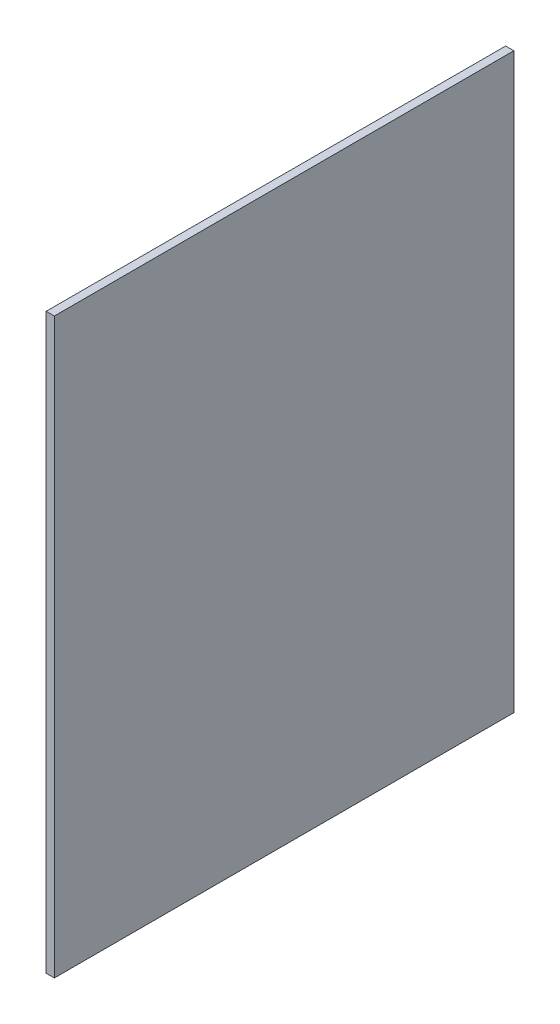
ISO-10303-21;
HEADER;
FILE_DESCRIPTION(('STEP AP214'),'2;1');
FILE_NAME('part.step','',(''),(''),'','','');
FILE_SCHEMA(('AUTOMOTIVE_DESIGN { 1 0 10303 214 1 1 1 1 }'));
ENDSEC;
DATA;
#1=APPLICATION_CONTEXT('core data for automotive mechanical design processes');
#2=APPLICATION_PROTOCOL_DEFINITION('international standard','automotive_design',2000,#1);
#3=PRODUCT_CONTEXT('',#1,'mechanical');
#4=PRODUCT('Part','Part','',(#3));
#5=PRODUCT_RELATED_PRODUCT_CATEGORY('part','',(#4));
#6=PRODUCT_DEFINITION_FORMATION('','',#4);
#7=PRODUCT_DEFINITION_CONTEXT('part definition',#1,'design');
#8=PRODUCT_DEFINITION('design','',#6,#7);
#9=PRODUCT_DEFINITION_SHAPE('','',#8);
#10=(LENGTH_UNIT() NAMED_UNIT(*) SI_UNIT(.MILLI.,.METRE.));
#11=(NAMED_UNIT(*) PLANE_ANGLE_UNIT() SI_UNIT($,.RADIAN.));
#12=(NAMED_UNIT(*) SI_UNIT($,.STERADIAN.) SOLID_ANGLE_UNIT());
#13=UNCERTAINTY_MEASURE_WITH_UNIT(LENGTH_MEASURE(1.E-05),#10,'distance_accuracy_value','');
#14=(GEOMETRIC_REPRESENTATION_CONTEXT(3) GLOBAL_UNCERTAINTY_ASSIGNED_CONTEXT((#13)) GLOBAL_UNIT_ASSIGNED_CONTEXT((#10,
#11,#12)) REPRESENTATION_CONTEXT('',''));
#15=CARTESIAN_POINT('',(0.,0.,0.));
#16=DIRECTION('',(0.,0.,1.));
#17=DIRECTION('',(1.,0.,0.));
#18=AXIS2_PLACEMENT_3D('',#15,#16,#17);
#19=CARTESIAN_POINT('',(5.,-60.4649234693877,104.47193877551));
#20=DIRECTION('',(0.,0.,-1.));
#21=DIRECTION('',(0.,1.,0.));
#22=AXIS2_PLACEMENT_3D('',#19,#20,#21);
#23=PLANE('',#22);
#24=DIRECTION('',(0.,-1.,0.));
#25=VECTOR('',#24,1.);
#26=CARTESIAN_POINT('',(0.,-60.4649234693877,104.47193877551));
#27=LINE('',#26,#25);
#28=CARTESIAN_POINT('',(0.,289.535076530612,104.47193877551));
#29=VERTEX_POINT('',#28);
#30=CARTESIAN_POINT('',(0.,-60.4649234693877,104.47193877551));
#31=VERTEX_POINT('',#30);
#32=EDGE_CURVE('E95',#29,#31,#27,.T.);
#33=ORIENTED_EDGE('',*,*,#32,.T.);
#34=DIRECTION('',(-1.,0.,0.));
#35=VECTOR('',#34,1.);
#36=CARTESIAN_POINT('',(5.,-60.4649234693877,104.47193877551));
#37=LINE('',#36,#35);
#38=CARTESIAN_POINT('',(5.,-60.4649234693877,104.47193877551));
#39=VERTEX_POINT('',#38);
#40=EDGE_CURVE('E11',#39,#31,#37,.T.);
#41=ORIENTED_EDGE('',*,*,#40,.F.);
#42=DIRECTION('',(0.,-1.,0.));
#43=VECTOR('',#42,1.);
#44=CARTESIAN_POINT('',(5.,-60.4649234693877,104.47193877551));
#45=LINE('',#44,#43);
#46=CARTESIAN_POINT('',(5.,289.535076530612,104.47193877551));
#47=VERTEX_POINT('',#46);
#48=EDGE_CURVE('E83',#47,#39,#45,.T.);
#49=ORIENTED_EDGE('',*,*,#48,.F.);
#50=DIRECTION('',(-1.,0.,0.));
#51=VECTOR('',#50,1.);
#52=CARTESIAN_POINT('',(5.,289.535076530612,104.47193877551));
#53=LINE('',#52,#51);
#54=EDGE_CURVE('E91',#47,#29,#53,.T.);
#55=ORIENTED_EDGE('',*,*,#54,.T.);
#56=EDGE_LOOP('',(#33,#41,#49,#55));
#57=FACE_BOUND('',#56,.T.);
#58=ADVANCED_FACE('F32',(#57),#23,.F.);
#59=CARTESIAN_POINT('',(5.,-60.4649234693877,104.47193877551));
#60=DIRECTION('',(0.,1.,0.));
#61=DIRECTION('',(0.,0.,1.));
#62=AXIS2_PLACEMENT_3D('',#59,#60,#61);
#63=PLANE('',#62);
#64=DIRECTION('',(0.,0.,-1.));
#65=VECTOR('',#64,1.);
#66=CARTESIAN_POINT('',(0.,-60.4649234693877,104.47193877551));
#67=LINE('',#66,#65);
#68=CARTESIAN_POINT('',(0.,-60.4649234693877,-176.02806122449));
#69=VERTEX_POINT('',#68);
#70=EDGE_CURVE('E87',#31,#69,#67,.T.);
#71=ORIENTED_EDGE('',*,*,#70,.T.);
#72=DIRECTION('',(-1.,0.,0.));
#73=VECTOR('',#72,1.);
#74=CARTESIAN_POINT('',(5.,-60.4649234693877,-176.02806122449));
#75=LINE('',#74,#73);
#76=CARTESIAN_POINT('',(5.,-60.4649234693877,-176.02806122449));
#77=VERTEX_POINT('',#76);
#78=EDGE_CURVE('E40',#77,#69,#75,.T.);
#79=ORIENTED_EDGE('',*,*,#78,.F.);
#80=DIRECTION('',(0.,0.,-1.));
#81=VECTOR('',#80,1.);
#82=CARTESIAN_POINT('',(5.,-60.4649234693877,104.47193877551));
#83=LINE('',#82,#81);
#84=EDGE_CURVE('E78',#39,#77,#83,.T.);
#85=ORIENTED_EDGE('',*,*,#84,.F.);
#86=ORIENTED_EDGE('',*,*,#40,.T.);
#87=EDGE_LOOP('',(#71,#79,#85,#86));
#88=FACE_BOUND('',#87,.T.);
#89=ADVANCED_FACE('F86',(#88),#63,.F.);
#90=CARTESIAN_POINT('',(5.,-60.4649234693877,-176.02806122449));
#91=DIRECTION('',(0.,0.,1.));
#92=DIRECTION('',(1.,0.,0.));
#93=AXIS2_PLACEMENT_3D('',#90,#91,#92);
#94=PLANE('',#93);
#95=DIRECTION('',(0.,1.,0.));
#96=VECTOR('',#95,1.);
#97=CARTESIAN_POINT('',(0.,-60.4649234693877,-176.02806122449));
#98=LINE('',#97,#96);
#99=CARTESIAN_POINT('',(0.,289.535076530612,-176.02806122449));
#100=VERTEX_POINT('',#99);
#101=EDGE_CURVE('E65',#69,#100,#98,.T.);
#102=ORIENTED_EDGE('',*,*,#101,.T.);
#103=DIRECTION('',(-1.,0.,0.));
#104=VECTOR('',#103,1.);
#105=CARTESIAN_POINT('',(5.,289.535076530612,-176.02806122449));
#106=LINE('',#105,#104);
#107=CARTESIAN_POINT('',(5.,289.535076530612,-176.02806122449));
#108=VERTEX_POINT('',#107);
#109=EDGE_CURVE('E88',#108,#100,#106,.T.);
#110=ORIENTED_EDGE('',*,*,#109,.F.);
#111=DIRECTION('',(0.,1.,0.));
#112=VECTOR('',#111,1.);
#113=CARTESIAN_POINT('',(5.,-60.4649234693877,-176.02806122449));
#114=LINE('',#113,#112);
#115=EDGE_CURVE('E81',#77,#108,#114,.T.);
#116=ORIENTED_EDGE('',*,*,#115,.F.);
#117=ORIENTED_EDGE('',*,*,#78,.T.);
#118=EDGE_LOOP('',(#102,#110,#116,#117));
#119=FACE_BOUND('',#118,.T.);
#120=ADVANCED_FACE('F89',(#119),#94,.F.);
#121=CARTESIAN_POINT('',(5.,289.535076530612,104.47193877551));
#122=DIRECTION('',(0.,-1.,0.));
#123=DIRECTION('',(0.,0.,-1.));
#124=AXIS2_PLACEMENT_3D('',#121,#122,#123);
#125=PLANE('',#124);
#126=DIRECTION('',(0.,0.,1.));
#127=VECTOR('',#126,1.);
#128=CARTESIAN_POINT('',(0.,289.535076530612,104.47193877551));
#129=LINE('',#128,#127);
#130=EDGE_CURVE('E71',#100,#29,#129,.T.);
#131=ORIENTED_EDGE('',*,*,#130,.T.);
#132=ORIENTED_EDGE('',*,*,#54,.F.);
#133=DIRECTION('',(0.,0.,1.));
#134=VECTOR('',#133,1.);
#135=CARTESIAN_POINT('',(5.,289.535076530612,104.47193877551));
#136=LINE('',#135,#134);
#137=EDGE_CURVE('E48',#108,#47,#136,.T.);
#138=ORIENTED_EDGE('',*,*,#137,.F.);
#139=ORIENTED_EDGE('',*,*,#109,.T.);
#140=EDGE_LOOP('',(#131,#132,#138,#139));
#141=FACE_BOUND('',#140,.T.);
#142=ADVANCED_FACE('F102',(#141),#125,.F.);
#143=CARTESIAN_POINT('',(5.,0.,0.));
#144=DIRECTION('',(-1.,0.,0.));
#145=DIRECTION('',(0.,0.,1.));
#146=AXIS2_PLACEMENT_3D('',#143,#144,#145);
#147=PLANE('',#146);
#148=ORIENTED_EDGE('',*,*,#48,.T.);
#149=ORIENTED_EDGE('',*,*,#84,.T.);
#150=ORIENTED_EDGE('',*,*,#115,.T.);
#151=ORIENTED_EDGE('',*,*,#137,.T.);
#152=EDGE_LOOP('',(#148,#149,#150,#151));
#153=FACE_BOUND('',#152,.T.);
#154=ADVANCED_FACE('F79',(#153),#147,.F.);
#155=CARTESIAN_POINT('',(0.,0.,0.));
#156=DIRECTION('',(-1.,0.,0.));
#157=DIRECTION('',(0.,0.,1.));
#158=AXIS2_PLACEMENT_3D('',#155,#156,#157);
#159=PLANE('',#158);
#160=ORIENTED_EDGE('',*,*,#32,.F.);
#161=ORIENTED_EDGE('',*,*,#130,.F.);
#162=ORIENTED_EDGE('',*,*,#101,.F.);
#163=ORIENTED_EDGE('',*,*,#70,.F.);
#164=EDGE_LOOP('',(#160,#161,#162,#163));
#165=FACE_BOUND('',#164,.T.);
#166=ADVANCED_FACE('F105',(#165),#159,.T.);
#167=CLOSED_SHELL('',(#58,#89,#120,#142,#154,#166));
#168=MANIFOLD_SOLID_BREP('B2',#167);
#169=ADVANCED_BREP_SHAPE_REPRESENTATION('',(#18,#168),#14);
#170=SHAPE_DEFINITION_REPRESENTATION(#9,#169);
ENDSEC;
END-ISO-10303-21;
